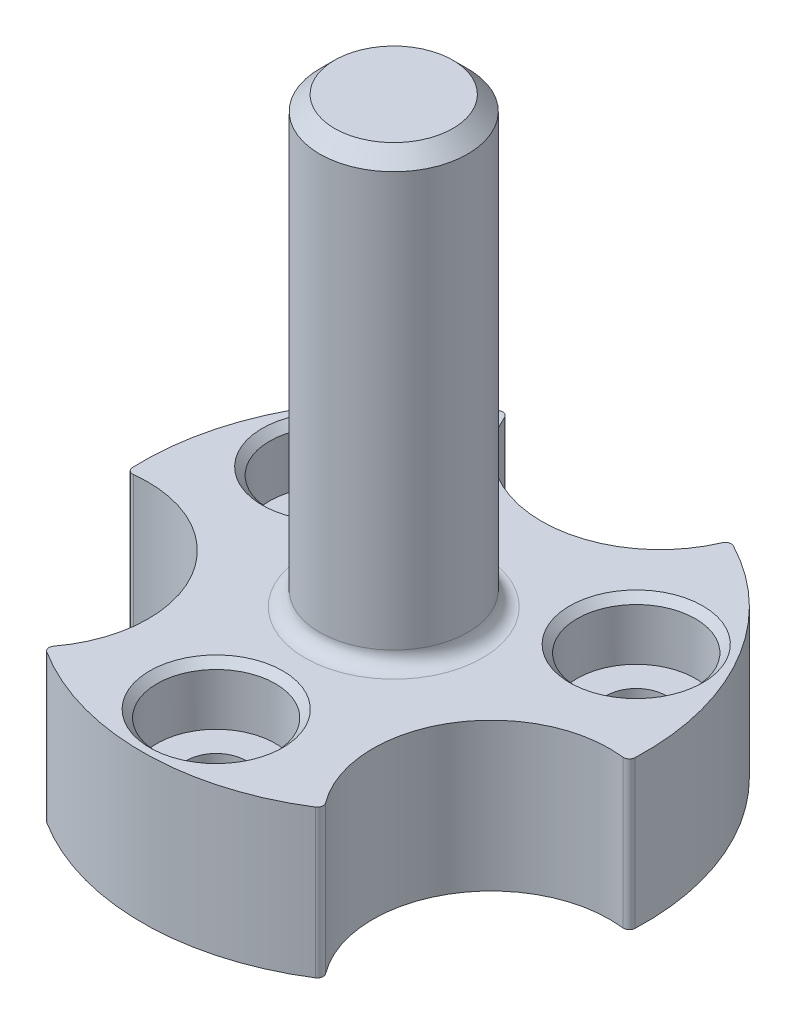
ISO-10303-21;
HEADER;
FILE_DESCRIPTION(('STEP AP214'),'2;1');
FILE_NAME('part.step','',(''),(''),'','','');
FILE_SCHEMA(('AUTOMOTIVE_DESIGN { 1 0 10303 214 1 1 1 1 }'));
ENDSEC;
DATA;
#1=APPLICATION_CONTEXT('core data for automotive mechanical design processes');
#2=APPLICATION_PROTOCOL_DEFINITION('international standard','automotive_design',2000,#1);
#3=PRODUCT_CONTEXT('',#1,'mechanical');
#4=PRODUCT('Part','Part','',(#3));
#5=PRODUCT_RELATED_PRODUCT_CATEGORY('part','',(#4));
#6=PRODUCT_DEFINITION_FORMATION('','',#4);
#7=PRODUCT_DEFINITION_CONTEXT('part definition',#1,'design');
#8=PRODUCT_DEFINITION('design','',#6,#7);
#9=PRODUCT_DEFINITION_SHAPE('','',#8);
#10=(LENGTH_UNIT() NAMED_UNIT(*) SI_UNIT(.MILLI.,.METRE.));
#11=(NAMED_UNIT(*) PLANE_ANGLE_UNIT() SI_UNIT($,.RADIAN.));
#12=(NAMED_UNIT(*) SI_UNIT($,.STERADIAN.) SOLID_ANGLE_UNIT());
#13=UNCERTAINTY_MEASURE_WITH_UNIT(LENGTH_MEASURE(1.E-05),#10,'distance_accuracy_value','');
#14=(GEOMETRIC_REPRESENTATION_CONTEXT(3) GLOBAL_UNCERTAINTY_ASSIGNED_CONTEXT((#13)) GLOBAL_UNIT_ASSIGNED_CONTEXT((#10,
#11,#12)) REPRESENTATION_CONTEXT('',''));
#15=CARTESIAN_POINT('',(0.,0.,0.));
#16=DIRECTION('',(0.,0.,1.));
#17=DIRECTION('',(1.,0.,0.));
#18=AXIS2_PLACEMENT_3D('',#15,#16,#17);
#19=CARTESIAN_POINT('',(5.1961524227074,20.001,-2.99999999999956));
#20=DIRECTION('',(0.,-1.,0.));
#21=DIRECTION('',(0.,0.,-1.));
#22=AXIS2_PLACEMENT_3D('',#19,#20,#21);
#23=CYLINDRICAL_SURFACE('',#22,1.00000000000073);
#24=CARTESIAN_POINT('',(5.1961524227074,0.,-2.99999999999956));
#25=DIRECTION('',(0.,-1.,0.));
#26=DIRECTION('',(0.,0.,-1.));
#27=AXIS2_PLACEMENT_3D('',#24,#25,#26);
#28=CIRCLE('',#27,1.00000000000073);
#29=CARTESIAN_POINT('',(5.1961524227074,0.,-4.00000000000029));
#30=VERTEX_POINT('',#29);
#31=EDGE_CURVE('E158',#30,#30,#28,.T.);
#32=ORIENTED_EDGE('',*,*,#31,.T.);
#33=EDGE_LOOP('',(#32));
#34=FACE_BOUND('',#33,.T.);
#35=CARTESIAN_POINT('',(5.1961524227074,3.,-2.99999999999956));
#36=DIRECTION('',(0.,1.,0.));
#37=DIRECTION('',(0.,0.,1.));
#38=AXIS2_PLACEMENT_3D('',#35,#36,#37);
#39=CIRCLE('',#38,1.00000000000073);
#40=CARTESIAN_POINT('',(5.1961524227074,3.,-1.99999999999882));
#41=VERTEX_POINT('',#40);
#42=EDGE_CURVE('E245',#41,#41,#39,.F.);
#43=ORIENTED_EDGE('',*,*,#42,.F.);
#44=EDGE_LOOP('',(#43));
#45=FACE_BOUND('',#44,.T.);
#46=ADVANCED_FACE('F32',(#34,#45),#23,.F.);
#47=CARTESIAN_POINT('',(-5.19615242270586,20.001,-3.00000000000044));
#48=DIRECTION('',(0.,-1.,0.));
#49=DIRECTION('',(0.,0.,-1.));
#50=AXIS2_PLACEMENT_3D('',#47,#48,#49);
#51=CYLINDRICAL_SURFACE('',#50,1.00000000000104);
#52=CARTESIAN_POINT('',(-5.19615242270586,0.,-3.00000000000044));
#53=DIRECTION('',(0.,-1.,0.));
#54=DIRECTION('',(0.,0.,-1.));
#55=AXIS2_PLACEMENT_3D('',#52,#53,#54);
#56=CIRCLE('',#55,1.00000000000104);
#57=CARTESIAN_POINT('',(-5.19615242270586,0.,-4.00000000000149));
#58=VERTEX_POINT('',#57);
#59=EDGE_CURVE('E239',#58,#58,#56,.T.);
#60=ORIENTED_EDGE('',*,*,#59,.T.);
#61=EDGE_LOOP('',(#60));
#62=FACE_BOUND('',#61,.T.);
#63=CARTESIAN_POINT('',(-5.19615242270586,3.,-3.00000000000044));
#64=DIRECTION('',(0.,1.,0.));
#65=DIRECTION('',(0.,0.,1.));
#66=AXIS2_PLACEMENT_3D('',#63,#64,#65);
#67=CIRCLE('',#66,1.00000000000104);
#68=CARTESIAN_POINT('',(-5.19615242270586,3.,-1.9999999999994));
#69=VERTEX_POINT('',#68);
#70=EDGE_CURVE('E241',#69,#69,#67,.F.);
#71=ORIENTED_EDGE('',*,*,#70,.F.);
#72=EDGE_LOOP('',(#71));
#73=FACE_BOUND('',#72,.T.);
#74=ADVANCED_FACE('F279',(#62,#73),#51,.F.);
#75=CARTESIAN_POINT('',(0.,20.001,6.));
#76=DIRECTION('',(0.,-1.,0.));
#77=DIRECTION('',(0.,0.,-1.));
#78=AXIS2_PLACEMENT_3D('',#75,#76,#77);
#79=CYLINDRICAL_SURFACE('',#78,1.);
#80=CARTESIAN_POINT('',(0.,0.,6.));
#81=DIRECTION('',(0.,-1.,0.));
#82=DIRECTION('',(0.,0.,-1.));
#83=AXIS2_PLACEMENT_3D('',#80,#81,#82);
#84=CIRCLE('',#83,1.);
#85=CARTESIAN_POINT('',(0.,0.,5.));
#86=VERTEX_POINT('',#85);
#87=EDGE_CURVE('E153',#86,#86,#84,.T.);
#88=ORIENTED_EDGE('',*,*,#87,.T.);
#89=EDGE_LOOP('',(#88));
#90=FACE_BOUND('',#89,.T.);
#91=CARTESIAN_POINT('',(0.,3.,6.));
#92=DIRECTION('',(0.,1.,0.));
#93=DIRECTION('',(0.,0.,1.));
#94=AXIS2_PLACEMENT_3D('',#91,#92,#93);
#95=CIRCLE('',#94,1.);
#96=CARTESIAN_POINT('',(0.,3.,7.));
#97=VERTEX_POINT('',#96);
#98=EDGE_CURVE('E236',#97,#97,#95,.F.);
#99=ORIENTED_EDGE('',*,*,#98,.F.);
#100=EDGE_LOOP('',(#99));
#101=FACE_BOUND('',#100,.T.);
#102=ADVANCED_FACE('F285',(#90,#101),#79,.F.);
#103=CARTESIAN_POINT('',(0.,20.,0.));
#104=DIRECTION('',(0.,1.,0.));
#105=DIRECTION('',(0.,0.,1.));
#106=AXIS2_PLACEMENT_3D('',#103,#104,#105);
#107=CYLINDRICAL_SURFACE('',#106,8.5);
#108=CARTESIAN_POINT('',(0.,5.,0.));
#109=DIRECTION('',(0.,1.,0.));
#110=DIRECTION('',(0.,0.,1.));
#111=AXIS2_PLACEMENT_3D('',#108,#109,#110);
#112=CIRCLE('',#111,8.5);
#113=CARTESIAN_POINT('',(-4.53911883999052,5.,7.18654299064878));
#114=VERTEX_POINT('',#113);
#115=CARTESIAN_POINT('',(4.53911883999075,5.,7.18654299064864));
#116=VERTEX_POINT('',#115);
#117=EDGE_CURVE('E175',#114,#116,#112,.T.);
#118=ORIENTED_EDGE('',*,*,#117,.F.);
#119=DIRECTION('',(0.,1.,0.));
#120=VECTOR('',#119,1.);
#121=CARTESIAN_POINT('',(-4.53911883999052,20.,7.18654299064878));
#122=LINE('',#121,#120);
#123=CARTESIAN_POINT('',(-4.53911883999052,0.,7.18654299064878));
#124=VERTEX_POINT('',#123);
#125=EDGE_CURVE('E224',#114,#124,#122,.F.);
#126=ORIENTED_EDGE('',*,*,#125,.T.);
#127=CARTESIAN_POINT('',(0.,0.,0.));
#128=DIRECTION('',(0.,1.,0.));
#129=DIRECTION('',(0.,0.,1.));
#130=AXIS2_PLACEMENT_3D('',#127,#128,#129);
#131=CIRCLE('',#130,8.5);
#132=CARTESIAN_POINT('',(4.53911883999075,0.,7.18654299064864));
#133=VERTEX_POINT('',#132);
#134=EDGE_CURVE('E178',#124,#133,#131,.T.);
#135=ORIENTED_EDGE('',*,*,#134,.T.);
#136=DIRECTION('',(0.,1.,0.));
#137=VECTOR('',#136,1.);
#138=CARTESIAN_POINT('',(4.53911883999075,20.,7.18654299064864));
#139=LINE('',#138,#137);
#140=EDGE_CURVE('E222',#133,#116,#139,.T.);
#141=ORIENTED_EDGE('',*,*,#140,.T.);
#142=EDGE_LOOP('',(#118,#126,#135,#141));
#143=FACE_BOUND('',#142,.T.);
#144=ADVANCED_FACE('F298',(#143),#107,.T.);
#145=CARTESIAN_POINT('',(-3.95416937529478,5.,-7.52426372155315));
#146=VERTEX_POINT('',#145);
#147=CARTESIAN_POINT('',(-8.4932882152861,5.,0.337720730903858));
#148=VERTEX_POINT('',#147);
#149=EDGE_CURVE('E179',#146,#148,#112,.T.);
#150=ORIENTED_EDGE('',*,*,#149,.F.);
#151=DIRECTION('',(0.,1.,0.));
#152=VECTOR('',#151,1.);
#153=CARTESIAN_POINT('',(-3.95416937529478,20.,-7.52426372155315));
#154=LINE('',#153,#152);
#155=CARTESIAN_POINT('',(-3.95416937529478,0.,-7.52426372155315));
#156=VERTEX_POINT('',#155);
#157=EDGE_CURVE('E129',#146,#156,#154,.F.);
#158=ORIENTED_EDGE('',*,*,#157,.T.);
#159=CARTESIAN_POINT('',(-8.4932882152861,0.,0.337720730903858));
#160=VERTEX_POINT('',#159);
#161=EDGE_CURVE('E184',#156,#160,#131,.T.);
#162=ORIENTED_EDGE('',*,*,#161,.T.);
#163=DIRECTION('',(0.,1.,0.));
#164=VECTOR('',#163,1.);
#165=CARTESIAN_POINT('',(-8.4932882152861,20.,0.337720730903858));
#166=LINE('',#165,#164);
#167=EDGE_CURVE('E134',#160,#148,#166,.T.);
#168=ORIENTED_EDGE('',*,*,#167,.T.);
#169=EDGE_LOOP('',(#150,#158,#162,#168));
#170=FACE_BOUND('',#169,.T.);
#171=ADVANCED_FACE('F319',(#170),#107,.T.);
#172=CARTESIAN_POINT('',(0.,19.5,0.));
#173=DIRECTION('',(0.,-1.,0.));
#174=DIRECTION('',(0.,0.,-1.));
#175=AXIS2_PLACEMENT_3D('',#172,#173,#174);
#176=CONICAL_SURFACE('',#175,2.5,0.785398163397451);
#177=CARTESIAN_POINT('',(0.,20.,0.));
#178=DIRECTION('',(0.,1.,0.));
#179=DIRECTION('',(0.,0.,1.));
#180=AXIS2_PLACEMENT_3D('',#177,#178,#179);
#181=CIRCLE('',#180,2.);
#182=CARTESIAN_POINT('',(0.,20.,2.));
#183=VERTEX_POINT('',#182);
#184=EDGE_CURVE('E193',#183,#183,#181,.T.);
#185=ORIENTED_EDGE('',*,*,#184,.F.);
#186=EDGE_LOOP('',(#185));
#187=FACE_BOUND('',#186,.T.);
#188=CARTESIAN_POINT('',(0.,19.5,0.));
#189=DIRECTION('',(0.,1.,0.));
#190=DIRECTION('',(0.,0.,1.));
#191=AXIS2_PLACEMENT_3D('',#188,#189,#190);
#192=CIRCLE('',#191,2.5);
#193=CARTESIAN_POINT('',(0.,19.5,2.5));
#194=VERTEX_POINT('',#193);
#195=EDGE_CURVE('E166',#194,#194,#192,.T.);
#196=ORIENTED_EDGE('',*,*,#195,.T.);
#197=EDGE_LOOP('',(#196));
#198=FACE_BOUND('',#197,.T.);
#199=ADVANCED_FACE('F338',(#187,#198),#176,.T.);
#200=CARTESIAN_POINT('',(2.,20.,0.));
#201=DIRECTION('',(0.,-1.,0.));
#202=DIRECTION('',(0.,0.,-1.));
#203=AXIS2_PLACEMENT_3D('',#200,#201,#202);
#204=PLANE('',#203);
#205=ORIENTED_EDGE('',*,*,#184,.T.);
#206=EDGE_LOOP('',(#205));
#207=FACE_BOUND('',#206,.T.);
#208=ADVANCED_FACE('F334',(#207),#204,.F.);
#209=CARTESIAN_POINT('',(4.5,2.,0.));
#210=DIRECTION('',(0.,1.,0.));
#211=DIRECTION('',(0.,0.,1.));
#212=AXIS2_PLACEMENT_3D('',#209,#210,#211);
#213=PLANE('',#212);
#214=CARTESIAN_POINT('',(0.,2.,0.));
#215=DIRECTION('',(0.,1.,0.));
#216=DIRECTION('',(0.,0.,1.));
#217=AXIS2_PLACEMENT_3D('',#214,#215,#216);
#218=CIRCLE('',#217,4.5);
#219=CARTESIAN_POINT('',(0.,2.,4.5));
#220=VERTEX_POINT('',#219);
#221=EDGE_CURVE('E190',#220,#220,#218,.T.);
#222=ORIENTED_EDGE('',*,*,#221,.F.);
#223=EDGE_LOOP('',(#222));
#224=FACE_BOUND('',#223,.T.);
#225=ADVANCED_FACE('F330',(#224),#213,.F.);
#226=CARTESIAN_POINT('',(0.,20.,0.));
#227=DIRECTION('',(0.,1.,0.));
#228=DIRECTION('',(0.,0.,1.));
#229=AXIS2_PLACEMENT_3D('',#226,#227,#228);
#230=CYLINDRICAL_SURFACE('',#229,4.5);
#231=CARTESIAN_POINT('',(0.,0.0999999999999994,0.));
#232=DIRECTION('',(0.,1.,0.));
#233=DIRECTION('',(0.,0.,1.));
#234=AXIS2_PLACEMENT_3D('',#231,#232,#233);
#235=CIRCLE('',#234,4.5);
#236=CARTESIAN_POINT('',(0.,0.0999999999999994,4.5));
#237=VERTEX_POINT('',#236);
#238=EDGE_CURVE('E187',#237,#237,#235,.T.);
#239=ORIENTED_EDGE('',*,*,#238,.F.);
#240=EDGE_LOOP('',(#239));
#241=FACE_BOUND('',#240,.T.);
#242=ORIENTED_EDGE('',*,*,#221,.T.);
#243=EDGE_LOOP('',(#242));
#244=FACE_BOUND('',#243,.T.);
#245=ADVANCED_FACE('F326',(#241,#244),#230,.F.);
#246=CARTESIAN_POINT('',(0.,0.0999999999999994,0.));
#247=DIRECTION('',(0.,-1.,0.));
#248=DIRECTION('',(0.,0.,-1.));
#249=AXIS2_PLACEMENT_3D('',#246,#247,#248);
#250=CONICAL_SURFACE('',#249,4.5,0.785398163397453);
#251=CARTESIAN_POINT('',(0.,0.,0.));
#252=DIRECTION('',(0.,1.,0.));
#253=DIRECTION('',(0.,0.,1.));
#254=AXIS2_PLACEMENT_3D('',#251,#252,#253);
#255=CIRCLE('',#254,4.6);
#256=CARTESIAN_POINT('',(0.,0.,4.6));
#257=VERTEX_POINT('',#256);
#258=EDGE_CURVE('E183',#257,#257,#255,.T.);
#259=ORIENTED_EDGE('',*,*,#258,.F.);
#260=EDGE_LOOP('',(#259));
#261=FACE_BOUND('',#260,.T.);
#262=ORIENTED_EDGE('',*,*,#238,.T.);
#263=EDGE_LOOP('',(#262));
#264=FACE_BOUND('',#263,.T.);
#265=ADVANCED_FACE('F322',(#261,#264),#250,.F.);
#266=CARTESIAN_POINT('',(4.6,0.,0.));
#267=DIRECTION('',(0.,1.,0.));
#268=DIRECTION('',(0.,0.,1.));
#269=AXIS2_PLACEMENT_3D('',#266,#267,#268);
#270=PLANE('',#269);
#271=ORIENTED_EDGE('',*,*,#59,.F.);
#272=EDGE_LOOP('',(#271));
#273=FACE_BOUND('',#272,.T.);
#274=ORIENTED_EDGE('',*,*,#31,.F.);
#275=EDGE_LOOP('',(#274));
#276=FACE_BOUND('',#275,.T.);
#277=ORIENTED_EDGE('',*,*,#87,.F.);
#278=EDGE_LOOP('',(#277));
#279=FACE_BOUND('',#278,.T.);
#280=ORIENTED_EDGE('',*,*,#161,.F.);
#281=CARTESIAN_POINT('',(-3.86113009587608,0.,-7.34722222222249));
#282=DIRECTION('',(0.,1.,0.));
#283=DIRECTION('',(0.,0.,1.));
#284=AXIS2_PLACEMENT_3D('',#281,#282,#283);
#285=CIRCLE('',#284,0.2);
#286=CARTESIAN_POINT('',(-3.67726675797718,0.,-7.42592592592616));
#287=VERTEX_POINT('',#286);
#288=EDGE_CURVE('E214',#156,#287,#285,.F.);
#289=ORIENTED_EDGE('',*,*,#288,.T.);
#290=CARTESIAN_POINT('',(8.15320033709099E-13,0.,-8.99999999999956));
#291=DIRECTION('',(0.,-1.,0.));
#292=DIRECTION('',(0.,0.,-1.));
#293=AXIS2_PLACEMENT_3D('',#290,#291,#292);
#294=CIRCLE('',#293,4.);
#295=CARTESIAN_POINT('',(3.67726675797852,0.,-7.42592592592549));
#296=VERTEX_POINT('',#295);
#297=EDGE_CURVE('E145',#296,#287,#294,.T.);
#298=ORIENTED_EDGE('',*,*,#297,.F.);
#299=CARTESIAN_POINT('',(3.86113009587741,0.,-7.34722222222179));
#300=DIRECTION('',(0.,1.,0.));
#301=DIRECTION('',(0.,0.,1.));
#302=AXIS2_PLACEMENT_3D('',#299,#300,#301);
#303=CIRCLE('',#302,0.2);
#304=CARTESIAN_POINT('',(3.95416937529614,0.,-7.52426372155244));
#305=VERTEX_POINT('',#304);
#306=EDGE_CURVE('E208',#296,#305,#303,.F.);
#307=ORIENTED_EDGE('',*,*,#306,.T.);
#308=CARTESIAN_POINT('',(8.49328821528608,0.,0.337720730904309));
#309=VERTEX_POINT('',#308);
#310=EDGE_CURVE('E180',#309,#305,#131,.T.);
#311=ORIENTED_EDGE('',*,*,#310,.F.);
#312=CARTESIAN_POINT('',(8.29344613963229,0.,0.329774360765384));
#313=DIRECTION('',(0.,1.,0.));
#314=DIRECTION('',(0.,0.,1.));
#315=AXIS2_PLACEMENT_3D('',#312,#313,#314);
#316=CIRCLE('',#315,0.2);
#317=CARTESIAN_POINT('',(8.26967387746218,0.,0.528356534062272));
#318=VERTEX_POINT('',#317);
#319=EDGE_CURVE('E47',#309,#318,#316,.F.);
#320=ORIENTED_EDGE('',*,*,#319,.T.);
#321=CARTESIAN_POINT('',(7.79422863405992,0.,4.50000000000004));
#322=DIRECTION('',(0.,-1.,0.));
#323=DIRECTION('',(0.,0.,-1.));
#324=AXIS2_PLACEMENT_3D('',#321,#322,#323);
#325=CIRCLE('',#324,4.);
#326=CARTESIAN_POINT('',(4.59240711948444,0.,6.89756939186372));
#327=VERTEX_POINT('',#326);
#328=EDGE_CURVE('E156',#327,#318,#325,.T.);
#329=ORIENTED_EDGE('',*,*,#328,.F.);
#330=CARTESIAN_POINT('',(4.43231604375567,0.,7.0174478614569));
#331=DIRECTION('',(0.,1.,0.));
#332=DIRECTION('',(0.,0.,1.));
#333=AXIS2_PLACEMENT_3D('',#330,#331,#332);
#334=CIRCLE('',#333,0.2);
#335=EDGE_CURVE('E55',#327,#133,#334,.F.);
#336=ORIENTED_EDGE('',*,*,#335,.T.);
#337=ORIENTED_EDGE('',*,*,#134,.F.);
#338=CARTESIAN_POINT('',(-4.43231604375545,0.,7.01744786145704));
#339=DIRECTION('',(0.,1.,0.));
#340=DIRECTION('',(0.,0.,1.));
#341=AXIS2_PLACEMENT_3D('',#338,#339,#340);
#342=CIRCLE('',#341,0.2);
#343=CARTESIAN_POINT('',(-4.5924071194842,0.,6.89756939186383));
#344=VERTEX_POINT('',#343);
#345=EDGE_CURVE('E210',#124,#344,#342,.F.);
#346=ORIENTED_EDGE('',*,*,#345,.T.);
#347=CARTESIAN_POINT('',(-7.79422863405921,0.,4.49999999999951));
#348=DIRECTION('',(0.,-1.,0.));
#349=DIRECTION('',(0.,0.,-1.));
#350=AXIS2_PLACEMENT_3D('',#347,#348,#349);
#351=CIRCLE('',#350,4.);
#352=CARTESIAN_POINT('',(-8.26967387746216,0.,0.528356534061828));
#353=VERTEX_POINT('',#352);
#354=EDGE_CURVE('E395',#353,#344,#351,.T.);
#355=ORIENTED_EDGE('',*,*,#354,.F.);
#356=CARTESIAN_POINT('',(-8.29344613963231,0.,0.329774360764944));
#357=DIRECTION('',(0.,1.,0.));
#358=DIRECTION('',(0.,0.,1.));
#359=AXIS2_PLACEMENT_3D('',#356,#357,#358);
#360=CIRCLE('',#359,0.2);
#361=EDGE_CURVE('E212',#353,#160,#360,.F.);
#362=ORIENTED_EDGE('',*,*,#361,.T.);
#363=EDGE_LOOP('',(#280,#289,#298,#307,#311,#320,#329,#336,#337,#346,#355,#362));
#364=FACE_BOUND('',#363,.T.);
#365=ORIENTED_EDGE('',*,*,#258,.T.);
#366=EDGE_LOOP('',(#365));
#367=FACE_BOUND('',#366,.T.);
#368=ADVANCED_FACE('F317',(#273,#276,#279,#364,#367),#270,.F.);
#369=ORIENTED_EDGE('',*,*,#310,.T.);
#370=DIRECTION('',(0.,1.,0.));
#371=VECTOR('',#370,1.);
#372=CARTESIAN_POINT('',(3.95416937529614,20.,-7.52426372155244));
#373=LINE('',#372,#371);
#374=CARTESIAN_POINT('',(3.95416937529614,5.,-7.52426372155244));
#375=VERTEX_POINT('',#374);
#376=EDGE_CURVE('E228',#305,#375,#373,.T.);
#377=ORIENTED_EDGE('',*,*,#376,.T.);
#378=CARTESIAN_POINT('',(8.49328821528608,5.,0.337720730904309));
#379=VERTEX_POINT('',#378);
#380=EDGE_CURVE('E176',#379,#375,#112,.T.);
#381=ORIENTED_EDGE('',*,*,#380,.F.);
#382=DIRECTION('',(0.,1.,0.));
#383=VECTOR('',#382,1.);
#384=CARTESIAN_POINT('',(8.49328821528608,20.,0.337720730904309));
#385=LINE('',#384,#383);
#386=EDGE_CURVE('E226',#379,#309,#385,.F.);
#387=ORIENTED_EDGE('',*,*,#386,.T.);
#388=EDGE_LOOP('',(#369,#377,#381,#387));
#389=FACE_BOUND('',#388,.T.);
#390=ADVANCED_FACE('F313',(#389),#107,.T.);
#391=CARTESIAN_POINT('',(8.5,5.,0.));
#392=DIRECTION('',(0.,-1.,0.));
#393=DIRECTION('',(0.,0.,-1.));
#394=AXIS2_PLACEMENT_3D('',#391,#392,#393);
#395=PLANE('',#394);
#396=CARTESIAN_POINT('',(-5.19615242270658,5.,-3.0000000000001));
#397=DIRECTION('',(0.,-1.,0.));
#398=DIRECTION('',(0.,0.,-1.));
#399=AXIS2_PLACEMENT_3D('',#396,#397,#398);
#400=CIRCLE('',#399,2.25000000000001);
#401=CARTESIAN_POINT('',(-5.19615242270658,5.,-5.25000000000011));
#402=VERTEX_POINT('',#401);
#403=EDGE_CURVE('E257',#402,#402,#400,.T.);
#404=ORIENTED_EDGE('',*,*,#403,.T.);
#405=EDGE_LOOP('',(#404));
#406=FACE_BOUND('',#405,.T.);
#407=CARTESIAN_POINT('',(0.,5.,6.));
#408=DIRECTION('',(0.,-1.,0.));
#409=DIRECTION('',(0.,0.,-1.));
#410=AXIS2_PLACEMENT_3D('',#407,#408,#409);
#411=CIRCLE('',#410,2.25000000000001);
#412=CARTESIAN_POINT('',(0.,5.,3.74999999999999));
#413=VERTEX_POINT('',#412);
#414=EDGE_CURVE('E254',#413,#413,#411,.T.);
#415=ORIENTED_EDGE('',*,*,#414,.T.);
#416=EDGE_LOOP('',(#415));
#417=FACE_BOUND('',#416,.T.);
#418=CARTESIAN_POINT('',(5.19615242270666,5.,-2.99999999999995));
#419=DIRECTION('',(0.,-1.,0.));
#420=DIRECTION('',(0.,0.,-1.));
#421=AXIS2_PLACEMENT_3D('',#418,#419,#420);
#422=CIRCLE('',#421,2.25000000000001);
#423=CARTESIAN_POINT('',(5.19615242270666,5.,-5.24999999999996));
#424=VERTEX_POINT('',#423);
#425=EDGE_CURVE('E251',#424,#424,#422,.T.);
#426=ORIENTED_EDGE('',*,*,#425,.T.);
#427=EDGE_LOOP('',(#426));
#428=FACE_BOUND('',#427,.T.);
#429=CARTESIAN_POINT('',(0.,5.,0.));
#430=DIRECTION('',(0.,1.,0.));
#431=DIRECTION('',(0.,0.,1.));
#432=AXIS2_PLACEMENT_3D('',#429,#430,#431);
#433=CIRCLE('',#432,3.);
#434=CARTESIAN_POINT('',(0.,5.,3.));
#435=VERTEX_POINT('',#434);
#436=EDGE_CURVE('E172',#435,#435,#433,.T.);
#437=ORIENTED_EDGE('',*,*,#436,.F.);
#438=EDGE_LOOP('',(#437));
#439=FACE_BOUND('',#438,.T.);
#440=CARTESIAN_POINT('',(8.15320033709099E-13,5.,-8.99999999999956));
#441=DIRECTION('',(0.,-1.,0.));
#442=DIRECTION('',(0.,0.,-1.));
#443=AXIS2_PLACEMENT_3D('',#440,#441,#442);
#444=CIRCLE('',#443,4.);
#445=CARTESIAN_POINT('',(-3.67726675797718,5.,-7.42592592592616));
#446=VERTEX_POINT('',#445);
#447=CARTESIAN_POINT('',(3.67726675797852,5.,-7.42592592592549));
#448=VERTEX_POINT('',#447);
#449=EDGE_CURVE('E142',#446,#448,#444,.F.);
#450=ORIENTED_EDGE('',*,*,#449,.F.);
#451=CARTESIAN_POINT('',(-3.86113009587608,5.,-7.34722222222249));
#452=DIRECTION('',(0.,-1.,0.));
#453=DIRECTION('',(0.,0.,-1.));
#454=AXIS2_PLACEMENT_3D('',#451,#452,#453);
#455=CIRCLE('',#454,0.2);
#456=EDGE_CURVE('E124',#446,#146,#455,.F.);
#457=ORIENTED_EDGE('',*,*,#456,.T.);
#458=ORIENTED_EDGE('',*,*,#149,.T.);
#459=CARTESIAN_POINT('',(-8.29344613963231,5.,0.329774360764944));
#460=DIRECTION('',(0.,-1.,0.));
#461=DIRECTION('',(0.,0.,-1.));
#462=AXIS2_PLACEMENT_3D('',#459,#460,#461);
#463=CIRCLE('',#462,0.2);
#464=CARTESIAN_POINT('',(-8.26967387746216,5.,0.528356534061828));
#465=VERTEX_POINT('',#464);
#466=EDGE_CURVE('E135',#148,#465,#463,.F.);
#467=ORIENTED_EDGE('',*,*,#466,.T.);
#468=CARTESIAN_POINT('',(-7.79422863405921,5.,4.49999999999951));
#469=DIRECTION('',(0.,-1.,0.));
#470=DIRECTION('',(0.,0.,-1.));
#471=AXIS2_PLACEMENT_3D('',#468,#469,#470);
#472=CIRCLE('',#471,4.);
#473=CARTESIAN_POINT('',(-4.5924071194842,5.,6.89756939186383));
#474=VERTEX_POINT('',#473);
#475=EDGE_CURVE('E393',#474,#465,#472,.F.);
#476=ORIENTED_EDGE('',*,*,#475,.F.);
#477=CARTESIAN_POINT('',(-4.43231604375545,5.,7.01744786145704));
#478=DIRECTION('',(0.,-1.,0.));
#479=DIRECTION('',(0.,0.,-1.));
#480=AXIS2_PLACEMENT_3D('',#477,#478,#479);
#481=CIRCLE('',#480,0.2);
#482=EDGE_CURVE('E201',#474,#114,#481,.F.);
#483=ORIENTED_EDGE('',*,*,#482,.T.);
#484=ORIENTED_EDGE('',*,*,#117,.T.);
#485=CARTESIAN_POINT('',(4.43231604375567,5.,7.0174478614569));
#486=DIRECTION('',(0.,-1.,0.));
#487=DIRECTION('',(0.,0.,-1.));
#488=AXIS2_PLACEMENT_3D('',#485,#486,#487);
#489=CIRCLE('',#488,0.2);
#490=CARTESIAN_POINT('',(4.59240711948444,5.,6.89756939186372));
#491=VERTEX_POINT('',#490);
#492=EDGE_CURVE('E146',#116,#491,#489,.F.);
#493=ORIENTED_EDGE('',*,*,#492,.T.);
#494=CARTESIAN_POINT('',(7.79422863405992,5.,4.50000000000004));
#495=DIRECTION('',(0.,-1.,0.));
#496=DIRECTION('',(0.,0.,-1.));
#497=AXIS2_PLACEMENT_3D('',#494,#495,#496);
#498=CIRCLE('',#497,4.);
#499=CARTESIAN_POINT('',(8.26967387746218,5.,0.528356534062272));
#500=VERTEX_POINT('',#499);
#501=EDGE_CURVE('E163',#500,#491,#498,.F.);
#502=ORIENTED_EDGE('',*,*,#501,.F.);
#503=CARTESIAN_POINT('',(8.29344613963229,5.,0.329774360765384));
#504=DIRECTION('',(0.,-1.,0.));
#505=DIRECTION('',(0.,0.,-1.));
#506=AXIS2_PLACEMENT_3D('',#503,#504,#505);
#507=CIRCLE('',#506,0.2);
#508=EDGE_CURVE('E198',#500,#379,#507,.F.);
#509=ORIENTED_EDGE('',*,*,#508,.T.);
#510=ORIENTED_EDGE('',*,*,#380,.T.);
#511=CARTESIAN_POINT('',(3.86113009587741,5.,-7.34722222222179));
#512=DIRECTION('',(0.,-1.,0.));
#513=DIRECTION('',(0.,0.,-1.));
#514=AXIS2_PLACEMENT_3D('',#511,#512,#513);
#515=CIRCLE('',#514,0.2);
#516=EDGE_CURVE('E152',#375,#448,#515,.F.);
#517=ORIENTED_EDGE('',*,*,#516,.T.);
#518=EDGE_LOOP('',(#450,#457,#458,#467,#476,#483,#484,#493,#502,#509,#510,#517));
#519=FACE_BOUND('',#518,.T.);
#520=ADVANCED_FACE('F149',(#406,#417,#428,#439,#519),#395,.F.);
#521=CARTESIAN_POINT('',(0.,5.5,0.));
#522=DIRECTION('',(0.,1.,0.));
#523=DIRECTION('',(0.,0.,1.));
#524=AXIS2_PLACEMENT_3D('',#521,#522,#523);
#525=TOROIDAL_SURFACE('',#524,3.,0.5);
#526=CARTESIAN_POINT('',(0.,5.5,0.));
#527=DIRECTION('',(0.,1.,0.));
#528=DIRECTION('',(0.,0.,1.));
#529=AXIS2_PLACEMENT_3D('',#526,#527,#528);
#530=CIRCLE('',#529,2.5);
#531=CARTESIAN_POINT('',(0.,5.5,2.5));
#532=VERTEX_POINT('',#531);
#533=EDGE_CURVE('E169',#532,#532,#530,.T.);
#534=ORIENTED_EDGE('',*,*,#533,.F.);
#535=EDGE_LOOP('',(#534));
#536=FACE_BOUND('',#535,.T.);
#537=ORIENTED_EDGE('',*,*,#436,.T.);
#538=EDGE_LOOP('',(#537));
#539=FACE_BOUND('',#538,.T.);
#540=ADVANCED_FACE('F306',(#536,#539),#525,.F.);
#541=CARTESIAN_POINT('',(0.,20.,0.));
#542=DIRECTION('',(0.,1.,0.));
#543=DIRECTION('',(0.,0.,1.));
#544=AXIS2_PLACEMENT_3D('',#541,#542,#543);
#545=CYLINDRICAL_SURFACE('',#544,2.5);
#546=ORIENTED_EDGE('',*,*,#195,.F.);
#547=EDGE_LOOP('',(#546));
#548=FACE_BOUND('',#547,.T.);
#549=ORIENTED_EDGE('',*,*,#533,.T.);
#550=EDGE_LOOP('',(#549));
#551=FACE_BOUND('',#550,.T.);
#552=ADVANCED_FACE('F302',(#548,#551),#545,.T.);
#553=CARTESIAN_POINT('',(7.79422863405992,20.001,4.50000000000004));
#554=DIRECTION('',(0.,-1.,0.));
#555=DIRECTION('',(0.,0.,-1.));
#556=AXIS2_PLACEMENT_3D('',#553,#554,#555);
#557=CYLINDRICAL_SURFACE('',#556,4.);
#558=ORIENTED_EDGE('',*,*,#328,.T.);
#559=DIRECTION('',(0.,-1.,0.));
#560=VECTOR('',#559,1.);
#561=CARTESIAN_POINT('',(8.26967387746218,20.001,0.528356534062272));
#562=LINE('',#561,#560);
#563=EDGE_CURVE('E232',#318,#500,#562,.F.);
#564=ORIENTED_EDGE('',*,*,#563,.T.);
#565=ORIENTED_EDGE('',*,*,#501,.T.);
#566=DIRECTION('',(0.,-1.,0.));
#567=VECTOR('',#566,1.);
#568=CARTESIAN_POINT('',(4.59240711948444,20.001,6.89756939186372));
#569=LINE('',#568,#567);
#570=EDGE_CURVE('E230',#491,#327,#569,.T.);
#571=ORIENTED_EDGE('',*,*,#570,.T.);
#572=EDGE_LOOP('',(#558,#564,#565,#571));
#573=FACE_BOUND('',#572,.T.);
#574=ADVANCED_FACE('F295',(#573),#557,.F.);
#575=CARTESIAN_POINT('',(8.15320033709099E-13,20.001,-8.99999999999956));
#576=DIRECTION('',(0.,-1.,0.));
#577=DIRECTION('',(0.,0.,-1.));
#578=AXIS2_PLACEMENT_3D('',#575,#576,#577);
#579=CYLINDRICAL_SURFACE('',#578,4.);
#580=ORIENTED_EDGE('',*,*,#297,.T.);
#581=DIRECTION('',(0.,-1.,0.));
#582=VECTOR('',#581,1.);
#583=CARTESIAN_POINT('',(-3.67726675797718,20.001,-7.42592592592616));
#584=LINE('',#583,#582);
#585=EDGE_CURVE('E128',#287,#446,#584,.F.);
#586=ORIENTED_EDGE('',*,*,#585,.T.);
#587=ORIENTED_EDGE('',*,*,#449,.T.);
#588=DIRECTION('',(0.,-1.,0.));
#589=VECTOR('',#588,1.);
#590=CARTESIAN_POINT('',(3.67726675797852,20.001,-7.42592592592549));
#591=LINE('',#590,#589);
#592=EDGE_CURVE('E147',#448,#296,#591,.T.);
#593=ORIENTED_EDGE('',*,*,#592,.T.);
#594=EDGE_LOOP('',(#580,#586,#587,#593));
#595=FACE_BOUND('',#594,.T.);
#596=ADVANCED_FACE('F140',(#595),#579,.F.);
#597=CARTESIAN_POINT('',(-7.79422863405921,20.001,4.49999999999951));
#598=DIRECTION('',(0.,-1.,0.));
#599=DIRECTION('',(0.,0.,-1.));
#600=AXIS2_PLACEMENT_3D('',#597,#598,#599);
#601=CYLINDRICAL_SURFACE('',#600,4.);
#602=ORIENTED_EDGE('',*,*,#475,.T.);
#603=DIRECTION('',(0.,-1.,0.));
#604=VECTOR('',#603,1.);
#605=CARTESIAN_POINT('',(-8.26967387746216,20.001,0.528356534061828));
#606=LINE('',#605,#604);
#607=EDGE_CURVE('E219',#465,#353,#606,.T.);
#608=ORIENTED_EDGE('',*,*,#607,.T.);
#609=ORIENTED_EDGE('',*,*,#354,.T.);
#610=DIRECTION('',(0.,-1.,0.));
#611=VECTOR('',#610,1.);
#612=CARTESIAN_POINT('',(-4.5924071194842,20.001,6.89756939186383));
#613=LINE('',#612,#611);
#614=EDGE_CURVE('E216',#344,#474,#613,.F.);
#615=ORIENTED_EDGE('',*,*,#614,.T.);
#616=EDGE_LOOP('',(#602,#608,#609,#615));
#617=FACE_BOUND('',#616,.T.);
#618=ADVANCED_FACE('F292',(#617),#601,.F.);
#619=CARTESIAN_POINT('',(-3.86113009587608,20.,-7.34722222222249));
#620=DIRECTION('',(0.,-1.,0.));
#621=DIRECTION('',(0.,0.,-1.));
#622=AXIS2_PLACEMENT_3D('',#619,#620,#621);
#623=CYLINDRICAL_SURFACE('',#622,0.2);
#624=ORIENTED_EDGE('',*,*,#288,.F.);
#625=ORIENTED_EDGE('',*,*,#157,.F.);
#626=ORIENTED_EDGE('',*,*,#456,.F.);
#627=ORIENTED_EDGE('',*,*,#585,.F.);
#628=EDGE_LOOP('',(#624,#625,#626,#627));
#629=FACE_BOUND('',#628,.T.);
#630=ADVANCED_FACE('F127',(#629),#623,.T.);
#631=CARTESIAN_POINT('',(-8.29344613963231,20.,0.329774360764944));
#632=DIRECTION('',(0.,1.,0.));
#633=DIRECTION('',(0.,0.,1.));
#634=AXIS2_PLACEMENT_3D('',#631,#632,#633);
#635=CYLINDRICAL_SURFACE('',#634,0.2);
#636=ORIENTED_EDGE('',*,*,#466,.F.);
#637=ORIENTED_EDGE('',*,*,#167,.F.);
#638=ORIENTED_EDGE('',*,*,#361,.F.);
#639=ORIENTED_EDGE('',*,*,#607,.F.);
#640=EDGE_LOOP('',(#636,#637,#638,#639));
#641=FACE_BOUND('',#640,.T.);
#642=ADVANCED_FACE('F345',(#641),#635,.T.);
#643=CARTESIAN_POINT('',(-4.43231604375545,20.,7.01744786145704));
#644=DIRECTION('',(0.,-1.,0.));
#645=DIRECTION('',(0.,0.,-1.));
#646=AXIS2_PLACEMENT_3D('',#643,#644,#645);
#647=CYLINDRICAL_SURFACE('',#646,0.2);
#648=ORIENTED_EDGE('',*,*,#345,.F.);
#649=ORIENTED_EDGE('',*,*,#125,.F.);
#650=ORIENTED_EDGE('',*,*,#482,.F.);
#651=ORIENTED_EDGE('',*,*,#614,.F.);
#652=EDGE_LOOP('',(#648,#649,#650,#651));
#653=FACE_BOUND('',#652,.T.);
#654=ADVANCED_FACE('F348',(#653),#647,.T.);
#655=CARTESIAN_POINT('',(3.86113009587741,20.,-7.34722222222179));
#656=DIRECTION('',(0.,1.,0.));
#657=DIRECTION('',(0.,0.,1.));
#658=AXIS2_PLACEMENT_3D('',#655,#656,#657);
#659=CYLINDRICAL_SURFACE('',#658,0.2);
#660=ORIENTED_EDGE('',*,*,#516,.F.);
#661=ORIENTED_EDGE('',*,*,#376,.F.);
#662=ORIENTED_EDGE('',*,*,#306,.F.);
#663=ORIENTED_EDGE('',*,*,#592,.F.);
#664=EDGE_LOOP('',(#660,#661,#662,#663));
#665=FACE_BOUND('',#664,.T.);
#666=ADVANCED_FACE('F352',(#665),#659,.T.);
#667=CARTESIAN_POINT('',(8.29344613963229,20.,0.329774360765384));
#668=DIRECTION('',(0.,-1.,0.));
#669=DIRECTION('',(0.,0.,-1.));
#670=AXIS2_PLACEMENT_3D('',#667,#668,#669);
#671=CYLINDRICAL_SURFACE('',#670,0.2);
#672=ORIENTED_EDGE('',*,*,#319,.F.);
#673=ORIENTED_EDGE('',*,*,#386,.F.);
#674=ORIENTED_EDGE('',*,*,#508,.F.);
#675=ORIENTED_EDGE('',*,*,#563,.F.);
#676=EDGE_LOOP('',(#672,#673,#674,#675));
#677=FACE_BOUND('',#676,.T.);
#678=ADVANCED_FACE('F356',(#677),#671,.T.);
#679=CARTESIAN_POINT('',(4.43231604375567,20.,7.0174478614569));
#680=DIRECTION('',(0.,1.,0.));
#681=DIRECTION('',(0.,0.,1.));
#682=AXIS2_PLACEMENT_3D('',#679,#680,#681);
#683=CYLINDRICAL_SURFACE('',#682,0.2);
#684=ORIENTED_EDGE('',*,*,#492,.F.);
#685=ORIENTED_EDGE('',*,*,#140,.F.);
#686=ORIENTED_EDGE('',*,*,#335,.F.);
#687=ORIENTED_EDGE('',*,*,#570,.F.);
#688=EDGE_LOOP('',(#684,#685,#686,#687));
#689=FACE_BOUND('',#688,.T.);
#690=ADVANCED_FACE('F360',(#689),#683,.T.);
#691=CARTESIAN_POINT('',(0.,3.,6.));
#692=DIRECTION('',(0.,1.,0.));
#693=DIRECTION('',(0.,0.,1.));
#694=AXIS2_PLACEMENT_3D('',#691,#692,#693);
#695=PLANE('',#694);
#696=CARTESIAN_POINT('',(0.,3.,6.));
#697=DIRECTION('',(0.,1.,0.));
#698=DIRECTION('',(0.,0.,1.));
#699=AXIS2_PLACEMENT_3D('',#696,#697,#698);
#700=CIRCLE('',#699,2.);
#701=CARTESIAN_POINT('',(0.,3.,8.));
#702=VERTEX_POINT('',#701);
#703=EDGE_CURVE('E240',#702,#702,#700,.T.);
#704=ORIENTED_EDGE('',*,*,#703,.T.);
#705=EDGE_LOOP('',(#704));
#706=FACE_BOUND('',#705,.T.);
#707=ORIENTED_EDGE('',*,*,#98,.T.);
#708=EDGE_LOOP('',(#707));
#709=FACE_BOUND('',#708,.T.);
#710=ADVANCED_FACE('F363',(#706,#709),#695,.T.);
#711=CARTESIAN_POINT('',(0.,3.,6.));
#712=DIRECTION('',(0.,1.,0.));
#713=DIRECTION('',(0.,0.,1.));
#714=AXIS2_PLACEMENT_3D('',#711,#712,#713);
#715=CYLINDRICAL_SURFACE('',#714,2.);
#716=CARTESIAN_POINT('',(0.,4.74999999999999,6.));
#717=DIRECTION('',(0.,-1.,0.));
#718=DIRECTION('',(0.,0.,-1.));
#719=AXIS2_PLACEMENT_3D('',#716,#717,#718);
#720=CIRCLE('',#719,2.);
#721=CARTESIAN_POINT('',(0.,4.74999999999999,4.));
#722=VERTEX_POINT('',#721);
#723=EDGE_CURVE('E40',#722,#722,#720,.F.);
#724=ORIENTED_EDGE('',*,*,#723,.T.);
#725=EDGE_LOOP('',(#724));
#726=FACE_BOUND('',#725,.T.);
#727=ORIENTED_EDGE('',*,*,#703,.F.);
#728=EDGE_LOOP('',(#727));
#729=FACE_BOUND('',#728,.T.);
#730=ADVANCED_FACE('F262',(#726,#729),#715,.F.);
#731=CARTESIAN_POINT('',(-5.19615242270658,3.,-3.0000000000001));
#732=DIRECTION('',(0.,1.,0.));
#733=DIRECTION('',(0.,0.,1.));
#734=AXIS2_PLACEMENT_3D('',#731,#732,#733);
#735=PLANE('',#734);
#736=CARTESIAN_POINT('',(-5.19615242270658,3.,-3.0000000000001));
#737=DIRECTION('',(0.,1.,0.));
#738=DIRECTION('',(0.,0.,1.));
#739=AXIS2_PLACEMENT_3D('',#736,#737,#738);
#740=CIRCLE('',#739,2.);
#741=CARTESIAN_POINT('',(-5.19615242270658,3.,-1.0000000000001));
#742=VERTEX_POINT('',#741);
#743=EDGE_CURVE('E244',#742,#742,#740,.T.);
#744=ORIENTED_EDGE('',*,*,#743,.T.);
#745=EDGE_LOOP('',(#744));
#746=FACE_BOUND('',#745,.T.);
#747=ORIENTED_EDGE('',*,*,#70,.T.);
#748=EDGE_LOOP('',(#747));
#749=FACE_BOUND('',#748,.T.);
#750=ADVANCED_FACE('F421',(#746,#749),#735,.T.);
#751=CARTESIAN_POINT('',(-5.19615242270658,3.,-3.0000000000001));
#752=DIRECTION('',(0.,1.,0.));
#753=DIRECTION('',(0.,0.,1.));
#754=AXIS2_PLACEMENT_3D('',#751,#752,#753);
#755=CYLINDRICAL_SURFACE('',#754,2.);
#756=CARTESIAN_POINT('',(-5.19615242270658,4.74999999999999,-3.0000000000001));
#757=DIRECTION('',(0.,-1.,0.));
#758=DIRECTION('',(0.,0.,-1.));
#759=AXIS2_PLACEMENT_3D('',#756,#757,#758);
#760=CIRCLE('',#759,2.);
#761=CARTESIAN_POINT('',(-5.19615242270658,4.74999999999999,-5.0000000000001));
#762=VERTEX_POINT('',#761);
#763=EDGE_CURVE('E235',#762,#762,#760,.F.);
#764=ORIENTED_EDGE('',*,*,#763,.T.);
#765=EDGE_LOOP('',(#764));
#766=FACE_BOUND('',#765,.T.);
#767=ORIENTED_EDGE('',*,*,#743,.F.);
#768=EDGE_LOOP('',(#767));
#769=FACE_BOUND('',#768,.T.);
#770=ADVANCED_FACE('F418',(#766,#769),#755,.F.);
#771=CARTESIAN_POINT('',(5.19615242270666,3.,-2.99999999999995));
#772=DIRECTION('',(0.,1.,0.));
#773=DIRECTION('',(0.,0.,1.));
#774=AXIS2_PLACEMENT_3D('',#771,#772,#773);
#775=PLANE('',#774);
#776=CARTESIAN_POINT('',(5.19615242270666,3.,-2.99999999999995));
#777=DIRECTION('',(0.,1.,0.));
#778=DIRECTION('',(0.,0.,1.));
#779=AXIS2_PLACEMENT_3D('',#776,#777,#778);
#780=CIRCLE('',#779,2.);
#781=CARTESIAN_POINT('',(5.19615242270666,3.,-0.999999999999953));
#782=VERTEX_POINT('',#781);
#783=EDGE_CURVE('E248',#782,#782,#780,.T.);
#784=ORIENTED_EDGE('',*,*,#783,.T.);
#785=EDGE_LOOP('',(#784));
#786=FACE_BOUND('',#785,.T.);
#787=ORIENTED_EDGE('',*,*,#42,.T.);
#788=EDGE_LOOP('',(#787));
#789=FACE_BOUND('',#788,.T.);
#790=ADVANCED_FACE('F409',(#786,#789),#775,.T.);
#791=CARTESIAN_POINT('',(5.19615242270666,3.,-2.99999999999995));
#792=DIRECTION('',(0.,1.,0.));
#793=DIRECTION('',(0.,0.,1.));
#794=AXIS2_PLACEMENT_3D('',#791,#792,#793);
#795=CYLINDRICAL_SURFACE('',#794,2.);
#796=CARTESIAN_POINT('',(5.19615242270666,4.74999999999999,-2.99999999999995));
#797=DIRECTION('',(0.,-1.,0.));
#798=DIRECTION('',(0.,0.,-1.));
#799=AXIS2_PLACEMENT_3D('',#796,#797,#798);
#800=CIRCLE('',#799,2.);
#801=CARTESIAN_POINT('',(5.19615242270666,4.74999999999999,-4.99999999999995));
#802=VERTEX_POINT('',#801);
#803=EDGE_CURVE('E11',#802,#802,#800,.F.);
#804=ORIENTED_EDGE('',*,*,#803,.T.);
#805=EDGE_LOOP('',(#804));
#806=FACE_BOUND('',#805,.T.);
#807=ORIENTED_EDGE('',*,*,#783,.F.);
#808=EDGE_LOOP('',(#807));
#809=FACE_BOUND('',#808,.T.);
#810=ADVANCED_FACE('F274',(#806,#809),#795,.F.);
#811=CARTESIAN_POINT('',(-5.19615242270658,4.74999999999999,-3.0000000000001));
#812=DIRECTION('',(0.,1.,0.));
#813=DIRECTION('',(0.,0.,1.));
#814=AXIS2_PLACEMENT_3D('',#811,#812,#813);
#815=CONICAL_SURFACE('',#814,2.,0.785398163397447);
#816=ORIENTED_EDGE('',*,*,#403,.F.);
#817=EDGE_LOOP('',(#816));
#818=FACE_BOUND('',#817,.T.);
#819=ORIENTED_EDGE('',*,*,#763,.F.);
#820=EDGE_LOOP('',(#819));
#821=FACE_BOUND('',#820,.T.);
#822=ADVANCED_FACE('F267',(#818,#821),#815,.F.);
#823=CARTESIAN_POINT('',(0.,4.74999999999999,6.));
#824=DIRECTION('',(0.,1.,0.));
#825=DIRECTION('',(0.,0.,1.));
#826=AXIS2_PLACEMENT_3D('',#823,#824,#825);
#827=CONICAL_SURFACE('',#826,2.,0.785398163397448);
#828=ORIENTED_EDGE('',*,*,#414,.F.);
#829=EDGE_LOOP('',(#828));
#830=FACE_BOUND('',#829,.T.);
#831=ORIENTED_EDGE('',*,*,#723,.F.);
#832=EDGE_LOOP('',(#831));
#833=FACE_BOUND('',#832,.T.);
#834=ADVANCED_FACE('F265',(#830,#833),#827,.F.);
#835=CARTESIAN_POINT('',(5.19615242270666,4.74999999999999,-2.99999999999995));
#836=DIRECTION('',(0.,1.,0.));
#837=DIRECTION('',(0.,0.,1.));
#838=AXIS2_PLACEMENT_3D('',#835,#836,#837);
#839=CONICAL_SURFACE('',#838,2.,0.785398163397449);
#840=ORIENTED_EDGE('',*,*,#425,.F.);
#841=EDGE_LOOP('',(#840));
#842=FACE_BOUND('',#841,.T.);
#843=ORIENTED_EDGE('',*,*,#803,.F.);
#844=EDGE_LOOP('',(#843));
#845=FACE_BOUND('',#844,.T.);
#846=ADVANCED_FACE('F34',(#842,#845),#839,.F.);
#847=CLOSED_SHELL('',(#46,#74,#102,#144,#171,#199,#208,#225,#245,#265,#368,#390,#520,#540,#552,
#574,#596,#618,#630,#642,#654,#666,#678,#690,#710,#730,#750,#770,#790,#810,#822,#834,#846));
#848=MANIFOLD_SOLID_BREP('B2',#847);
#849=ADVANCED_BREP_SHAPE_REPRESENTATION('',(#18,#848),#14);
#850=SHAPE_DEFINITION_REPRESENTATION(#9,#849);
ENDSEC;
END-ISO-10303-21;
